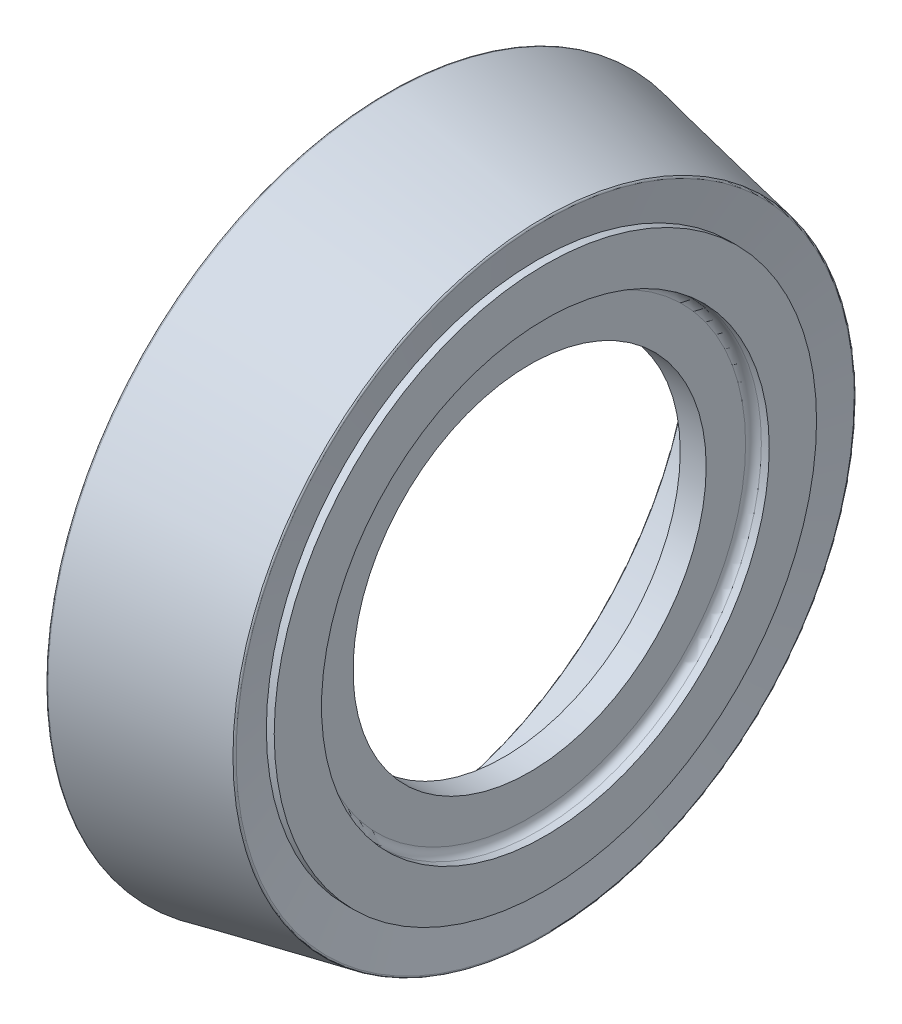
ISO-10303-21;
HEADER;
FILE_DESCRIPTION(('STEP AP214'),'2;1');
FILE_NAME('part.step','',(''),(''),'','','');
FILE_SCHEMA(('AUTOMOTIVE_DESIGN { 1 0 10303 214 1 1 1 1 }'));
ENDSEC;
DATA;
#1=APPLICATION_CONTEXT('core data for automotive mechanical design processes');
#2=APPLICATION_PROTOCOL_DEFINITION('international standard','automotive_design',2000,#1);
#3=PRODUCT_CONTEXT('',#1,'mechanical');
#4=PRODUCT('Part','Part','',(#3));
#5=PRODUCT_RELATED_PRODUCT_CATEGORY('part','',(#4));
#6=PRODUCT_DEFINITION_FORMATION('','',#4);
#7=PRODUCT_DEFINITION_CONTEXT('part definition',#1,'design');
#8=PRODUCT_DEFINITION('design','',#6,#7);
#9=PRODUCT_DEFINITION_SHAPE('','',#8);
#10=(LENGTH_UNIT() NAMED_UNIT(*) SI_UNIT(.MILLI.,.METRE.));
#11=(NAMED_UNIT(*) PLANE_ANGLE_UNIT() SI_UNIT($,.RADIAN.));
#12=(NAMED_UNIT(*) SI_UNIT($,.STERADIAN.) SOLID_ANGLE_UNIT());
#13=UNCERTAINTY_MEASURE_WITH_UNIT(LENGTH_MEASURE(1.E-05),#10,'distance_accuracy_value','');
#14=(GEOMETRIC_REPRESENTATION_CONTEXT(3) GLOBAL_UNCERTAINTY_ASSIGNED_CONTEXT((#13)) GLOBAL_UNIT_ASSIGNED_CONTEXT((#10,
#11,#12)) REPRESENTATION_CONTEXT('',''));
#15=CARTESIAN_POINT('',(0.,0.,0.));
#16=DIRECTION('',(0.,0.,1.));
#17=DIRECTION('',(1.,0.,0.));
#18=AXIS2_PLACEMENT_3D('',#15,#16,#17);
#19=CARTESIAN_POINT('',(0.901941932430907,-11.7,0.));
#20=DIRECTION('',(-1.,0.,0.));
#21=DIRECTION('',(0.,0.,1.));
#22=AXIS2_PLACEMENT_3D('',#19,#20,#21);
#23=CONICAL_SURFACE('',#22,19.7196116135138,0.197395559849881);
#24=CARTESIAN_POINT('',(-8.88038838648618,-11.7,0.));
#25=DIRECTION('',(1.,0.,0.));
#26=DIRECTION('',(0.,0.,-1.));
#27=AXIS2_PLACEMENT_3D('',#24,#25,#26);
#28=CIRCLE('',#27,21.6760776772972);
#29=CARTESIAN_POINT('',(-8.88038838648618,-11.7,-21.6760776772972));
#30=VERTEX_POINT('',#29);
#31=EDGE_CURVE('E12',#30,#30,#28,.T.);
#32=ORIENTED_EDGE('',*,*,#31,.T.);
#33=EDGE_LOOP('',(#32));
#34=FACE_BOUND('',#33,.T.);
#35=CARTESIAN_POINT('',(0.901941932430907,-11.7,0.));
#36=DIRECTION('',(1.,0.,0.));
#37=DIRECTION('',(0.,0.,-1.));
#38=AXIS2_PLACEMENT_3D('',#35,#36,#37);
#39=CIRCLE('',#38,19.7196116135138);
#40=CARTESIAN_POINT('',(0.901941932430907,-11.7,-19.7196116135138));
#41=VERTEX_POINT('',#40);
#42=EDGE_CURVE('E88',#41,#41,#39,.T.);
#43=ORIENTED_EDGE('',*,*,#42,.F.);
#44=EDGE_LOOP('',(#43));
#45=FACE_BOUND('',#44,.T.);
#46=ADVANCED_FACE('F42',(#34,#45),#23,.T.);
#47=CARTESIAN_POINT('',(-8.9,-11.7,0.));
#48=DIRECTION('',(1.,0.,0.));
#49=DIRECTION('',(0.,0.,-1.));
#50=AXIS2_PLACEMENT_3D('',#47,#48,#49);
#51=TOROIDAL_SURFACE('',#50,21.5780196097281,0.0999999999999995);
#52=CARTESIAN_POINT('',(-9.,-11.7,0.));
#53=DIRECTION('',(1.,0.,0.));
#54=DIRECTION('',(0.,0.,-1.));
#55=AXIS2_PLACEMENT_3D('',#52,#53,#54);
#56=CIRCLE('',#55,21.5780196097281);
#57=CARTESIAN_POINT('',(-9.,-11.7,-21.5780196097281));
#58=VERTEX_POINT('',#57);
#59=EDGE_CURVE('E48',#58,#58,#56,.T.);
#60=ORIENTED_EDGE('',*,*,#59,.T.);
#61=EDGE_LOOP('',(#60));
#62=FACE_BOUND('',#61,.T.);
#63=ORIENTED_EDGE('',*,*,#31,.F.);
#64=EDGE_LOOP('',(#63));
#65=FACE_BOUND('',#64,.T.);
#66=ADVANCED_FACE('F96',(#62,#65),#51,.T.);
#67=CARTESIAN_POINT('',(-9.,0.,0.));
#68=DIRECTION('',(1.,0.,0.));
#69=DIRECTION('',(0.,0.,-1.));
#70=AXIS2_PLACEMENT_3D('',#67,#68,#69);
#71=PLANE('',#70);
#72=ORIENTED_EDGE('',*,*,#59,.F.);
#73=EDGE_LOOP('',(#72));
#74=FACE_BOUND('',#73,.T.);
#75=CARTESIAN_POINT('',(-9.,-11.7,0.));
#76=DIRECTION('',(1.,0.,0.));
#77=DIRECTION('',(0.,0.,-1.));
#78=AXIS2_PLACEMENT_3D('',#75,#76,#77);
#79=CIRCLE('',#78,19.2819803902719);
#80=CARTESIAN_POINT('',(-9.,-11.7,-19.2819803902719));
#81=VERTEX_POINT('',#80);
#82=EDGE_CURVE('E52',#81,#81,#79,.T.);
#83=ORIENTED_EDGE('',*,*,#82,.T.);
#84=EDGE_LOOP('',(#83));
#85=FACE_BOUND('',#84,.T.);
#86=ADVANCED_FACE('F100',(#74,#85),#71,.F.);
#87=CARTESIAN_POINT('',(-8.9,-11.7,0.));
#88=DIRECTION('',(1.,0.,0.));
#89=DIRECTION('',(0.,0.,-1.));
#90=AXIS2_PLACEMENT_3D('',#87,#88,#89);
#91=TOROIDAL_SURFACE('',#90,19.2819803902719,0.0999999999999988);
#92=CARTESIAN_POINT('',(-8.91961161351382,-11.7,0.));
#93=DIRECTION('',(1.,0.,0.));
#94=DIRECTION('',(0.,0.,-1.));
#95=AXIS2_PLACEMENT_3D('',#92,#93,#94);
#96=CIRCLE('',#95,19.1839223227028);
#97=CARTESIAN_POINT('',(-8.91961161351382,-11.7,-19.1839223227028));
#98=VERTEX_POINT('',#97);
#99=EDGE_CURVE('E56',#98,#98,#96,.T.);
#100=ORIENTED_EDGE('',*,*,#99,.T.);
#101=EDGE_LOOP('',(#100));
#102=FACE_BOUND('',#101,.T.);
#103=ORIENTED_EDGE('',*,*,#82,.F.);
#104=EDGE_LOOP('',(#103));
#105=FACE_BOUND('',#104,.T.);
#106=ADVANCED_FACE('F104',(#102,#105),#91,.T.);
#107=CARTESIAN_POINT('',(-8.91961161351382,-11.7,0.));
#108=DIRECTION('',(-1.,0.,0.));
#109=DIRECTION('',(0.,0.,1.));
#110=AXIS2_PLACEMENT_3D('',#107,#108,#109);
#111=CONICAL_SURFACE('',#110,19.1839223227028,0.197395559849881);
#112=CARTESIAN_POINT('',(-1.6456449323181,-11.7,0.));
#113=DIRECTION('',(1.,0.,0.));
#114=DIRECTION('',(0.,0.,-1.));
#115=AXIS2_PLACEMENT_3D('',#112,#113,#114);
#116=CIRCLE('',#115,17.7291289864636);
#117=CARTESIAN_POINT('',(-1.6456449323181,-11.7,-17.7291289864636));
#118=VERTEX_POINT('',#117);
#119=EDGE_CURVE('E61',#118,#118,#116,.T.);
#120=ORIENTED_EDGE('',*,*,#119,.T.);
#121=EDGE_LOOP('',(#120));
#122=FACE_BOUND('',#121,.T.);
#123=ORIENTED_EDGE('',*,*,#99,.F.);
#124=EDGE_LOOP('',(#123));
#125=FACE_BOUND('',#124,.T.);
#126=ADVANCED_FACE('F111',(#122,#125),#111,.F.);
#127=CARTESIAN_POINT('',(-1.6456449323181,0.,0.));
#128=DIRECTION('',(-1.,0.,0.));
#129=DIRECTION('',(0.,0.,1.));
#130=AXIS2_PLACEMENT_3D('',#127,#128,#129);
#131=PLANE('',#130);
#132=CARTESIAN_POINT('',(-1.6456449323181,-11.7,0.));
#133=DIRECTION('',(1.,0.,0.));
#134=DIRECTION('',(0.,0.,-1.));
#135=AXIS2_PLACEMENT_3D('',#132,#133,#134);
#136=CIRCLE('',#135,11.2);
#137=CARTESIAN_POINT('',(-1.6456449323181,-11.7,-11.2));
#138=VERTEX_POINT('',#137);
#139=EDGE_CURVE('E64',#138,#138,#136,.T.);
#140=ORIENTED_EDGE('',*,*,#139,.T.);
#141=EDGE_LOOP('',(#140));
#142=FACE_BOUND('',#141,.T.);
#143=ORIENTED_EDGE('',*,*,#119,.F.);
#144=EDGE_LOOP('',(#143));
#145=FACE_BOUND('',#144,.T.);
#146=ADVANCED_FACE('F115',(#142,#145),#131,.T.);
#147=CARTESIAN_POINT('',(0.,-11.7,0.));
#148=DIRECTION('',(1.,0.,0.));
#149=DIRECTION('',(0.,0.,-1.));
#150=AXIS2_PLACEMENT_3D('',#147,#148,#149);
#151=CYLINDRICAL_SURFACE('',#150,11.2);
#152=CARTESIAN_POINT('',(0.,-11.7,0.));
#153=DIRECTION('',(1.,0.,0.));
#154=DIRECTION('',(0.,0.,-1.));
#155=AXIS2_PLACEMENT_3D('',#152,#153,#154);
#156=CIRCLE('',#155,11.2);
#157=CARTESIAN_POINT('',(0.,-11.7,-11.2));
#158=VERTEX_POINT('',#157);
#159=EDGE_CURVE('E67',#158,#158,#156,.T.);
#160=ORIENTED_EDGE('',*,*,#159,.T.);
#161=EDGE_LOOP('',(#160));
#162=FACE_BOUND('',#161,.T.);
#163=ORIENTED_EDGE('',*,*,#139,.F.);
#164=EDGE_LOOP('',(#163));
#165=FACE_BOUND('',#164,.T.);
#166=ADVANCED_FACE('F119',(#162,#165),#151,.F.);
#167=CARTESIAN_POINT('',(0.,0.,0.));
#168=DIRECTION('',(-1.,0.,0.));
#169=DIRECTION('',(0.,0.,1.));
#170=AXIS2_PLACEMENT_3D('',#167,#168,#169);
#171=PLANE('',#170);
#172=ORIENTED_EDGE('',*,*,#159,.F.);
#173=EDGE_LOOP('',(#172));
#174=FACE_BOUND('',#173,.T.);
#175=CARTESIAN_POINT('',(0.,-11.7,0.));
#176=DIRECTION('',(1.,0.,0.));
#177=DIRECTION('',(0.,0.,-1.));
#178=AXIS2_PLACEMENT_3D('',#175,#176,#177);
#179=CIRCLE('',#178,13.7);
#180=CARTESIAN_POINT('',(0.,-11.7,-13.7));
#181=VERTEX_POINT('',#180);
#182=EDGE_CURVE('E70',#181,#181,#179,.T.);
#183=ORIENTED_EDGE('',*,*,#182,.T.);
#184=EDGE_LOOP('',(#183));
#185=FACE_BOUND('',#184,.T.);
#186=ADVANCED_FACE('F123',(#174,#185),#171,.F.);
#187=CARTESIAN_POINT('',(0.5,-11.7,0.));
#188=DIRECTION('',(1.,0.,0.));
#189=DIRECTION('',(0.,0.,-1.));
#190=AXIS2_PLACEMENT_3D('',#187,#188,#189);
#191=TOROIDAL_SURFACE('',#190,13.7,0.5);
#192=CARTESIAN_POINT('',(0.5,-11.7,0.));
#193=DIRECTION('',(1.,0.,0.));
#194=DIRECTION('',(0.,0.,-1.));
#195=AXIS2_PLACEMENT_3D('',#192,#193,#194);
#196=CIRCLE('',#195,14.2);
#197=CARTESIAN_POINT('',(0.5,-11.7,-14.2));
#198=VERTEX_POINT('',#197);
#199=EDGE_CURVE('E73',#198,#198,#196,.T.);
#200=ORIENTED_EDGE('',*,*,#199,.T.);
#201=EDGE_LOOP('',(#200));
#202=FACE_BOUND('',#201,.T.);
#203=ORIENTED_EDGE('',*,*,#182,.F.);
#204=EDGE_LOOP('',(#203));
#205=FACE_BOUND('',#204,.T.);
#206=ADVANCED_FACE('F127',(#202,#205),#191,.F.);
#207=CARTESIAN_POINT('',(0.,-11.7,0.));
#208=DIRECTION('',(1.,0.,0.));
#209=DIRECTION('',(0.,0.,-1.));
#210=AXIS2_PLACEMENT_3D('',#207,#208,#209);
#211=CYLINDRICAL_SURFACE('',#210,14.2);
#212=ORIENTED_EDGE('',*,*,#199,.F.);
#213=EDGE_LOOP('',(#212));
#214=FACE_BOUND('',#213,.T.);
#215=CARTESIAN_POINT('',(1.,-11.7,0.));
#216=DIRECTION('',(1.,0.,0.));
#217=DIRECTION('',(0.,0.,-1.));
#218=AXIS2_PLACEMENT_3D('',#215,#216,#217);
#219=CIRCLE('',#218,14.2);
#220=CARTESIAN_POINT('',(1.,-11.7,-14.2));
#221=VERTEX_POINT('',#220);
#222=EDGE_CURVE('E76',#221,#221,#219,.T.);
#223=ORIENTED_EDGE('',*,*,#222,.T.);
#224=EDGE_LOOP('',(#223));
#225=FACE_BOUND('',#224,.T.);
#226=ADVANCED_FACE('F131',(#214,#225),#211,.F.);
#227=CARTESIAN_POINT('',(1.,0.,0.));
#228=DIRECTION('',(1.,0.,0.));
#229=DIRECTION('',(0.,0.,-1.));
#230=AXIS2_PLACEMENT_3D('',#227,#228,#229);
#231=PLANE('',#230);
#232=CARTESIAN_POINT('',(1.,-11.7,0.));
#233=DIRECTION('',(1.,0.,0.));
#234=DIRECTION('',(0.,0.,-1.));
#235=AXIS2_PLACEMENT_3D('',#232,#233,#234);
#236=CIRCLE('',#235,17.2);
#237=CARTESIAN_POINT('',(1.,-11.7,-17.2));
#238=VERTEX_POINT('',#237);
#239=EDGE_CURVE('E79',#238,#238,#236,.T.);
#240=ORIENTED_EDGE('',*,*,#239,.T.);
#241=EDGE_LOOP('',(#240));
#242=FACE_BOUND('',#241,.T.);
#243=ORIENTED_EDGE('',*,*,#222,.F.);
#244=EDGE_LOOP('',(#243));
#245=FACE_BOUND('',#244,.T.);
#246=ADVANCED_FACE('F135',(#242,#245),#231,.T.);
#247=CARTESIAN_POINT('',(0.,-11.7,0.));
#248=DIRECTION('',(1.,0.,0.));
#249=DIRECTION('',(0.,0.,-1.));
#250=AXIS2_PLACEMENT_3D('',#247,#248,#249);
#251=CYLINDRICAL_SURFACE('',#250,17.2);
#252=CARTESIAN_POINT('',(0.5,-11.7,0.));
#253=DIRECTION('',(1.,0.,0.));
#254=DIRECTION('',(0.,0.,-1.));
#255=AXIS2_PLACEMENT_3D('',#252,#253,#254);
#256=CIRCLE('',#255,17.2);
#257=CARTESIAN_POINT('',(0.5,-11.7,-17.2));
#258=VERTEX_POINT('',#257);
#259=EDGE_CURVE('E82',#258,#258,#256,.T.);
#260=ORIENTED_EDGE('',*,*,#259,.T.);
#261=EDGE_LOOP('',(#260));
#262=FACE_BOUND('',#261,.T.);
#263=ORIENTED_EDGE('',*,*,#239,.F.);
#264=EDGE_LOOP('',(#263));
#265=FACE_BOUND('',#264,.T.);
#266=ADVANCED_FACE('F139',(#262,#265),#251,.T.);
#267=CARTESIAN_POINT('',(0.5,-11.7,0.));
#268=DIRECTION('',(1.,0.,0.));
#269=DIRECTION('',(0.,0.,-1.));
#270=AXIS2_PLACEMENT_3D('',#267,#268,#269);
#271=CONICAL_SURFACE('',#270,17.2,1.37340076694502);
#272=CARTESIAN_POINT('',(0.980388386486182,-11.7,0.));
#273=DIRECTION('',(1.,0.,0.));
#274=DIRECTION('',(0.,0.,-1.));
#275=AXIS2_PLACEMENT_3D('',#272,#273,#274);
#276=CIRCLE('',#275,19.6019419324309);
#277=CARTESIAN_POINT('',(0.980388386486182,-11.7,-19.6019419324309));
#278=VERTEX_POINT('',#277);
#279=EDGE_CURVE('E85',#278,#278,#276,.T.);
#280=ORIENTED_EDGE('',*,*,#279,.T.);
#281=EDGE_LOOP('',(#280));
#282=FACE_BOUND('',#281,.T.);
#283=ORIENTED_EDGE('',*,*,#259,.F.);
#284=EDGE_LOOP('',(#283));
#285=FACE_BOUND('',#284,.T.);
#286=ADVANCED_FACE('F143',(#282,#285),#271,.F.);
#287=CARTESIAN_POINT('',(0.882330318917088,-11.7,0.));
#288=DIRECTION('',(1.,0.,0.));
#289=DIRECTION('',(0.,0.,-1.));
#290=AXIS2_PLACEMENT_3D('',#287,#288,#289);
#291=TOROIDAL_SURFACE('',#290,19.6215535459447,0.100000000000001);
#292=ORIENTED_EDGE('',*,*,#42,.T.);
#293=EDGE_LOOP('',(#292));
#294=FACE_BOUND('',#293,.T.);
#295=ORIENTED_EDGE('',*,*,#279,.F.);
#296=EDGE_LOOP('',(#295));
#297=FACE_BOUND('',#296,.T.);
#298=ADVANCED_FACE('F92',(#294,#297),#291,.T.);
#299=CLOSED_SHELL('',(#46,#66,#86,#106,#126,#146,#166,#186,#206,#226,#246,#266,#286,#298));
#300=MANIFOLD_SOLID_BREP('B2',#299);
#301=ADVANCED_BREP_SHAPE_REPRESENTATION('',(#18,#300),#14);
#302=SHAPE_DEFINITION_REPRESENTATION(#9,#301);
ENDSEC;
END-ISO-10303-21;
